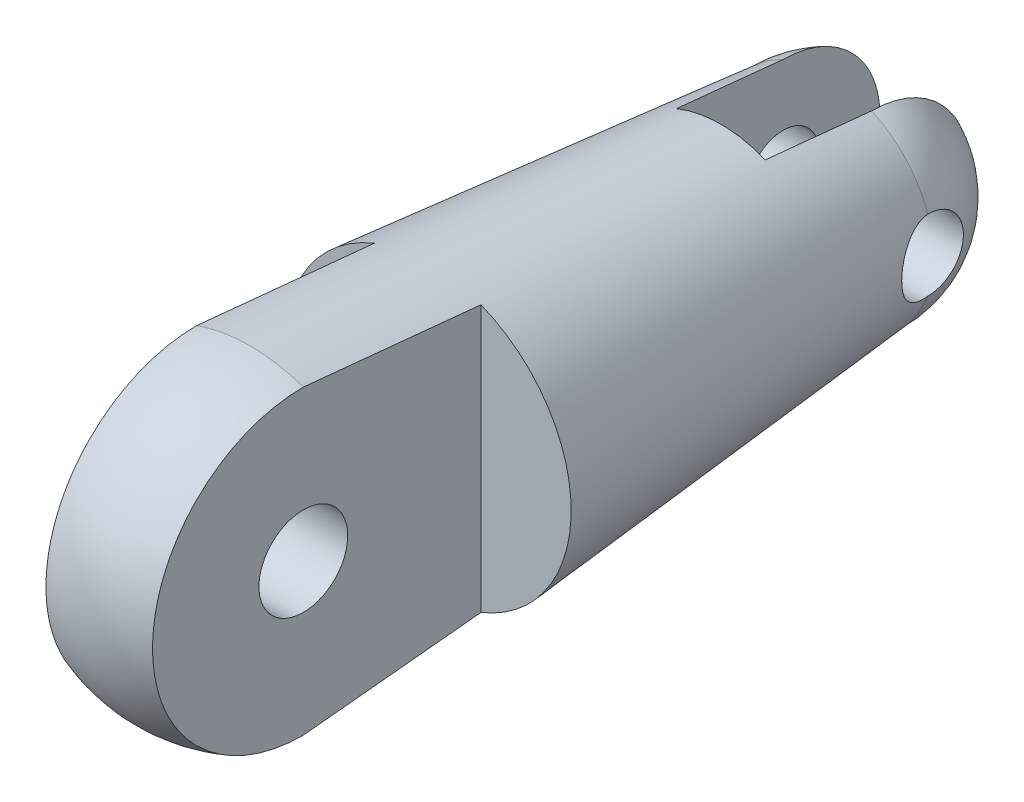
ISO-10303-21;
HEADER;
FILE_DESCRIPTION(('STEP AP214'),'2;1');
FILE_NAME('part.step','',(''),(''),'','','');
FILE_SCHEMA(('AUTOMOTIVE_DESIGN { 1 0 10303 214 1 1 1 1 }'));
ENDSEC;
DATA;
#1=APPLICATION_CONTEXT('core data for automotive mechanical design processes');
#2=APPLICATION_PROTOCOL_DEFINITION('international standard','automotive_design',2000,#1);
#3=PRODUCT_CONTEXT('',#1,'mechanical');
#4=PRODUCT('Part','Part','',(#3));
#5=PRODUCT_RELATED_PRODUCT_CATEGORY('part','',(#4));
#6=PRODUCT_DEFINITION_FORMATION('','',#4);
#7=PRODUCT_DEFINITION_CONTEXT('part definition',#1,'design');
#8=PRODUCT_DEFINITION('design','',#6,#7);
#9=PRODUCT_DEFINITION_SHAPE('','',#8);
#10=(LENGTH_UNIT() NAMED_UNIT(*) SI_UNIT(.MILLI.,.METRE.));
#11=(NAMED_UNIT(*) PLANE_ANGLE_UNIT() SI_UNIT($,.RADIAN.));
#12=(NAMED_UNIT(*) SI_UNIT($,.STERADIAN.) SOLID_ANGLE_UNIT());
#13=UNCERTAINTY_MEASURE_WITH_UNIT(LENGTH_MEASURE(1.E-05),#10,'distance_accuracy_value','');
#14=(GEOMETRIC_REPRESENTATION_CONTEXT(3) GLOBAL_UNCERTAINTY_ASSIGNED_CONTEXT((#13)) GLOBAL_UNIT_ASSIGNED_CONTEXT((#10,
#11,#12)) REPRESENTATION_CONTEXT('',''));
#15=CARTESIAN_POINT('',(0.,0.,0.));
#16=DIRECTION('',(0.,0.,1.));
#17=DIRECTION('',(1.,0.,0.));
#18=AXIS2_PLACEMENT_3D('',#15,#16,#17);
#19=CARTESIAN_POINT('',(0.,0.,-65.));
#20=DIRECTION('',(0.,0.,1.));
#21=DIRECTION('',(0.,1.,0.));
#22=AXIS2_PLACEMENT_3D('',#19,#20,#21);
#23=SPHERICAL_SURFACE('',#22,12.);
#24=CARTESIAN_POINT('',(0.,0.,-65.));
#25=DIRECTION('',(0.,0.,1.));
#26=DIRECTION('',(1.,0.,0.));
#27=AXIS2_PLACEMENT_3D('',#24,#25,#26);
#28=CIRCLE('',#27,12.);
#29=CARTESIAN_POINT('',(5.,-10.9087121146357,-65.));
#30=VERTEX_POINT('',#29);
#31=CARTESIAN_POINT('',(11.3137084989848,-4.00000000000001,-65.));
#32=VERTEX_POINT('',#31);
#33=EDGE_CURVE('E231',#30,#32,#28,.T.);
#34=ORIENTED_EDGE('',*,*,#33,.F.);
#35=CARTESIAN_POINT('',(5.,0.,-65.));
#36=DIRECTION('',(1.,0.,0.));
#37=DIRECTION('',(0.,0.,-1.));
#38=AXIS2_PLACEMENT_3D('',#35,#36,#37);
#39=CIRCLE('',#38,10.9087121146357);
#40=CARTESIAN_POINT('',(5.,10.9087121146357,-65.));
#41=VERTEX_POINT('',#40);
#42=EDGE_CURVE('E287',#30,#41,#39,.T.);
#43=ORIENTED_EDGE('',*,*,#42,.T.);
#44=CARTESIAN_POINT('',(11.3137084989848,4.00000000000001,-65.));
#45=VERTEX_POINT('',#44);
#46=EDGE_CURVE('E230',#45,#41,#28,.T.);
#47=ORIENTED_EDGE('',*,*,#46,.F.);
#48=CARTESIAN_POINT('',(11.3137084989847,0.,-65.));
#49=DIRECTION('',(-1.,0.,0.));
#50=DIRECTION('',(0.,0.,1.));
#51=AXIS2_PLACEMENT_3D('',#48,#49,#50);
#52=CIRCLE('',#51,4.00000000000001);
#53=EDGE_CURVE('E242',#45,#32,#52,.T.);
#54=ORIENTED_EDGE('',*,*,#53,.T.);
#55=EDGE_LOOP('',(#34,#43,#47,#54));
#56=FACE_BOUND('',#55,.T.);
#57=ADVANCED_FACE('F32',(#56),#23,.T.);
#58=CARTESIAN_POINT('',(-30.,0.,-65.));
#59=DIRECTION('',(1.,0.,0.));
#60=DIRECTION('',(0.,0.,-1.));
#61=AXIS2_PLACEMENT_3D('',#58,#59,#60);
#62=CYLINDRICAL_SURFACE('',#61,4.00000000000001);
#63=CARTESIAN_POINT('',(4.99999999999999,0.,-65.));
#64=DIRECTION('',(1.,0.,0.));
#65=DIRECTION('',(0.,0.,-1.));
#66=AXIS2_PLACEMENT_3D('',#63,#64,#65);
#67=CIRCLE('',#66,4.00000000000001);
#68=CARTESIAN_POINT('',(4.99999999999999,0.,-69.));
#69=VERTEX_POINT('',#68);
#70=EDGE_CURVE('E127',#69,#69,#67,.F.);
#71=ORIENTED_EDGE('',*,*,#70,.T.);
#72=EDGE_LOOP('',(#71));
#73=FACE_BOUND('',#72,.T.);
#74=CARTESIAN_POINT('',(11.3136889193321,-3.99999999500001,-65.0002));
#75=CARTESIAN_POINT('',(11.324630492324,-4.0000188985444,-64.888247238381));
#76=CARTESIAN_POINT('',(11.3372486413354,-3.99531162899844,-64.7764769898527));
#77=CARTESIAN_POINT('',(11.3655641849048,-3.97663549686389,-64.5541508803589));
#78=CARTESIAN_POINT('',(11.3812603159082,-3.96267042914925,-64.4435945406672));
#79=CARTESIAN_POINT('',(11.4154143093294,-3.9257265038677,-64.2247921820178));
#80=CARTESIAN_POINT('',(11.4338634610291,-3.90277571851407,-64.1165400643584));
#81=CARTESIAN_POINT('',(11.4731840801899,-3.84814246383926,-63.9027359940164));
#82=CARTESIAN_POINT('',(11.4940557452726,-3.81645928186475,-63.7971842624816));
#83=CARTESIAN_POINT('',(11.559638645672,-3.70883318762587,-63.4858524141516));
#84=CARTESIAN_POINT('',(11.6073928872525,-3.62023374742587,-63.284930133438));
#85=CARTESIAN_POINT('',(11.7072018660043,-3.41204049024545,-62.9010012743523));
#86=CARTESIAN_POINT('',(11.7592600905391,-3.29242136810618,-62.7180094919973));
#87=CARTESIAN_POINT('',(11.8660065035331,-3.01899452747802,-62.3660853926821));
#88=CARTESIAN_POINT('',(11.9207070077118,-2.86388360770343,-62.1981653894313));
#89=CARTESIAN_POINT('',(12.0257497683932,-2.52652920648225,-61.8905361327172));
#90=CARTESIAN_POINT('',(12.0760919238863,-2.34428509645979,-61.7508275329846));
#91=CARTESIAN_POINT('',(12.1681710436765,-1.95605825144464,-61.5032812826041));
#92=CARTESIAN_POINT('',(12.2098687593808,-1.74997358962555,-61.3955880727964));
#93=CARTESIAN_POINT('',(12.2803265364761,-1.32036795446154,-61.2170576727753));
#94=CARTESIAN_POINT('',(12.3090936181085,-1.09685651992023,-61.1462004804382));
#95=CARTESIAN_POINT('',(12.3493582530347,-0.654347967796119,-61.0478074394223));
#96=CARTESIAN_POINT('',(12.3618563838865,-0.436001028523253,-61.0177560856577));
#97=CARTESIAN_POINT('',(12.3717322504596,0.00297592825515853,-60.9939719305204));
#98=CARTESIAN_POINT('',(12.3691147767116,0.22360520030433,-61.0002276224977));
#99=CARTESIAN_POINT('',(12.3495504719681,0.648911475360917,-61.047487353356));
#100=CARTESIAN_POINT('',(12.3333447909486,0.853826583284769,-61.086694361935));
#101=CARTESIAN_POINT('',(12.2889802636455,1.2538754461441,-61.1959490856155));
#102=CARTESIAN_POINT('',(12.2608204334004,1.44900839441866,-61.2659993394821));
#103=CARTESIAN_POINT('',(12.1940933773547,1.82894584984347,-61.43639574557));
#104=CARTESIAN_POINT('',(12.155308845525,2.01342460556392,-61.5373803592151));
#105=CARTESIAN_POINT('',(12.0706713673664,2.36324052008424,-61.7659934453423));
#106=CARTESIAN_POINT('',(12.0248162909227,2.52857188405443,-61.8936299512518));
#107=CARTESIAN_POINT('',(11.9260954182738,2.84752303078532,-62.1820298449835));
#108=CARTESIAN_POINT('',(11.8729641362216,2.99954440517304,-62.344472731323));
#109=CARTESIAN_POINT('',(11.7667145237685,3.27472007230911,-62.6923019711751));
#110=CARTESIAN_POINT('',(11.7135962209198,3.39785674378613,-62.8777022251405));
#111=CARTESIAN_POINT('',(11.6095193682877,3.61659298206936,-63.2755367904688));
#112=CARTESIAN_POINT('',(11.5587413121279,3.71084124737574,-63.4887726094521));
#113=CARTESIAN_POINT('',(11.4895367142718,3.82357742171291,-63.8193851027782));
#114=CARTESIAN_POINT('',(11.4676342359538,3.85637811472637,-63.9313486010845));
#115=CARTESIAN_POINT('',(11.4265983754263,3.91215366490002,-64.1581765854436));
#116=CARTESIAN_POINT('',(11.4074636254566,3.93513338645341,-64.2730396054161));
#117=CARTESIAN_POINT('',(11.374666630502,3.96863060781973,-64.489726954363));
#118=CARTESIAN_POINT('',(11.3606163195393,3.98038006902405,-64.5913045317568));
#119=CARTESIAN_POINT('',(11.3351419759609,3.99606707357586,-64.7952698753495));
#120=CARTESIAN_POINT('',(11.3237150140991,4.00001336785234,-64.8976566045423));
#121=CARTESIAN_POINT('',(11.3136889193321,3.99999999500001,-65.0002));
#122=B_SPLINE_CURVE_WITH_KNOTS('',3,(#74,#75,#76,#77,#78,#79,#80,#81,#82,#83,#84,#85,#86,#87,
#88,#89,#90,#91,#92,#93,#94,#95,#96,#97,#98,#99,#100,#101,#102,#103,#104,#105,#106,#107,#108,
#109,#110,#111,#112,#113,#114,#115,#116,#117,#118,#119,#120,#121),.UNSPECIFIED.,.F.,.F.,(4,2,2,
2,2,2,2,2,2,2,2,2,2,2,2,2,2,2,2,2,2,2,2,4),(0.,0.337318177737528,0.674498170446622,
1.01063308078467,1.34679543131353,2.01770306442448,2.68915974013327,3.39103130635216,
4.09291913487536,4.79792715378902,5.50255194924793,6.16139700846207,6.82003327389311,
7.44491914756016,8.06985646637195,8.70867695803341,9.34769028197918,10.0308541061781,
10.7144336205814,11.4263172043703,11.7820541468133,12.137614685574,12.4469397547951,
12.7559177315556),.UNSPECIFIED.);
#123=EDGE_CURVE('E176',#32,#45,#122,.T.);
#124=ORIENTED_EDGE('',*,*,#123,.F.);
#125=ORIENTED_EDGE('',*,*,#53,.F.);
#126=EDGE_LOOP('',(#124,#125));
#127=FACE_BOUND('',#126,.T.);
#128=ADVANCED_FACE('F199',(#73,#127),#62,.F.);
#129=CARTESIAN_POINT('',(0.,0.,0.));
#130=DIRECTION('',(0.,0.,1.));
#131=DIRECTION('',(0.,1.,0.));
#132=AXIS2_PLACEMENT_3D('',#129,#130,#131);
#133=SPHERICAL_SURFACE('',#132,18.);
#134=CARTESIAN_POINT('',(0.,0.,0.));
#135=DIRECTION('',(0.,0.,1.));
#136=DIRECTION('',(1.,0.,0.));
#137=AXIS2_PLACEMENT_3D('',#134,#135,#136);
#138=CIRCLE('',#137,18.);
#139=CARTESIAN_POINT('',(-6.,-16.9705627484771,0.));
#140=VERTEX_POINT('',#139);
#141=CARTESIAN_POINT('',(6.,-16.9705627484771,0.));
#142=VERTEX_POINT('',#141);
#143=EDGE_CURVE('E236',#140,#142,#138,.T.);
#144=ORIENTED_EDGE('',*,*,#143,.T.);
#145=CARTESIAN_POINT('',(6.,0.,0.));
#146=DIRECTION('',(-1.,0.,0.));
#147=DIRECTION('',(0.,0.,1.));
#148=AXIS2_PLACEMENT_3D('',#145,#146,#147);
#149=CIRCLE('',#148,16.9705627484771);
#150=CARTESIAN_POINT('',(6.,16.9705627484771,0.));
#151=VERTEX_POINT('',#150);
#152=EDGE_CURVE('E268',#142,#151,#149,.T.);
#153=ORIENTED_EDGE('',*,*,#152,.T.);
#154=CARTESIAN_POINT('',(-6.,16.9705627484771,0.));
#155=VERTEX_POINT('',#154);
#156=EDGE_CURVE('E234',#151,#155,#138,.T.);
#157=ORIENTED_EDGE('',*,*,#156,.T.);
#158=CARTESIAN_POINT('',(-6.,0.,0.));
#159=DIRECTION('',(1.,0.,0.));
#160=DIRECTION('',(0.,0.,-1.));
#161=AXIS2_PLACEMENT_3D('',#158,#159,#160);
#162=CIRCLE('',#161,16.9705627484771);
#163=EDGE_CURVE('E253',#155,#140,#162,.T.);
#164=ORIENTED_EDGE('',*,*,#163,.T.);
#165=EDGE_LOOP('',(#144,#153,#157,#164));
#166=FACE_BOUND('',#165,.T.);
#167=ADVANCED_FACE('F34',(#166),#133,.T.);
#168=CARTESIAN_POINT('',(-5.,10.9087121146357,-65.));
#169=VERTEX_POINT('',#168);
#170=CARTESIAN_POINT('',(-11.3137084989848,4.00000000000001,-65.));
#171=VERTEX_POINT('',#170);
#172=EDGE_CURVE('E227',#169,#171,#28,.T.);
#173=ORIENTED_EDGE('',*,*,#172,.F.);
#174=CARTESIAN_POINT('',(-5.,0.,-65.));
#175=DIRECTION('',(-1.,0.,0.));
#176=DIRECTION('',(0.,0.,1.));
#177=AXIS2_PLACEMENT_3D('',#174,#175,#176);
#178=CIRCLE('',#177,10.9087121146357);
#179=CARTESIAN_POINT('',(-5.,-10.9087121146357,-65.));
#180=VERTEX_POINT('',#179);
#181=EDGE_CURVE('E47',#169,#180,#178,.T.);
#182=ORIENTED_EDGE('',*,*,#181,.T.);
#183=CARTESIAN_POINT('',(-11.3137084989848,-4.00000000000001,-65.));
#184=VERTEX_POINT('',#183);
#185=EDGE_CURVE('E126',#184,#180,#28,.T.);
#186=ORIENTED_EDGE('',*,*,#185,.F.);
#187=CARTESIAN_POINT('',(-11.3137084989848,0.,-65.));
#188=DIRECTION('',(1.,0.,0.));
#189=DIRECTION('',(0.,0.,-1.));
#190=AXIS2_PLACEMENT_3D('',#187,#188,#189);
#191=CIRCLE('',#190,4.00000000000001);
#192=EDGE_CURVE('E228',#184,#171,#191,.T.);
#193=ORIENTED_EDGE('',*,*,#192,.T.);
#194=EDGE_LOOP('',(#173,#182,#186,#193));
#195=FACE_BOUND('',#194,.T.);
#196=ADVANCED_FACE('F209',(#195),#23,.T.);
#197=CARTESIAN_POINT('',(0.,0.,-65.));
#198=DIRECTION('',(0.,0.,1.));
#199=DIRECTION('',(1.,0.,0.));
#200=AXIS2_PLACEMENT_3D('',#197,#198,#199);
#201=CONICAL_SURFACE('',#200,12.,0.0920468488634067);
#202=CARTESIAN_POINT('',(0.,0.,-20.));
#203=DIRECTION('',(0.,0.,-1.));
#204=DIRECTION('',(-1.,0.,0.));
#205=AXIS2_PLACEMENT_3D('',#202,#203,#204);
#206=CIRCLE('',#205,16.1538461538461);
#207=CARTESIAN_POINT('',(6.,14.9982247470202,-20.));
#208=VERTEX_POINT('',#207);
#209=CARTESIAN_POINT('',(6.,-14.9982247470202,-20.));
#210=VERTEX_POINT('',#209);
#211=EDGE_CURVE('E166',#208,#210,#206,.T.);
#212=ORIENTED_EDGE('',*,*,#211,.T.);
#213=CARTESIAN_POINT('',(6.,-12.4328661753176,-45.4465645818424));
#214=CARTESIAN_POINT('',(6.,-12.6477037814034,-43.3504001328621));
#215=CARTESIAN_POINT('',(6.,-12.8615170062301,-41.2541310091683));
#216=CARTESIAN_POINT('',(6.,-13.287347927037,-37.0614107162263));
#217=CARTESIAN_POINT('',(6.,-13.4993656233162,-34.9649595470085));
#218=CARTESIAN_POINT('',(6.,-14.1331050409651,-28.6753762093162));
#219=CARTESIAN_POINT('',(6.,-14.5525134315511,-24.4820108815449));
#220=CARTESIAN_POINT('',(6.,-15.1382375429859,-18.5920969027039));
#221=CARTESIAN_POINT('',(6.,-15.3065393320408,-16.8957452521665));
#222=CARTESIAN_POINT('',(6.,-15.9736676961094,-10.1573857753291));
#223=CARTESIAN_POINT('',(6.,-16.4697384962365,-5.11510485333078));
#224=CARTESIAN_POINT('',(6.,-17.2103134061365,2.44866122563647));
#225=CARTESIAN_POINT('',(6.,-17.4565831483887,4.96997390399984));
#226=CARTESIAN_POINT('',(6.,-17.9480760871612,10.0127009259002));
#227=CARTESIAN_POINT('',(6.,-18.193299283824,12.5341152694233));
#228=CARTESIAN_POINT('',(6.,-18.4380645122989,15.0555741282608));
#229=B_SPLINE_CURVE_WITH_KNOTS('',3,(#213,#214,#215,#216,#217,#218,#219,#220,#221,#222,#223,
#224,#225,#226,#227,#228),.UNSPECIFIED.,.F.,.F.,(4,2,2,2,2,2,2,4),(0.,6.32143464463242,
12.6428682365382,25.2857253805145,30.3997657999397,45.5996352670396,53.1995692131898,
60.7995021254498),.UNSPECIFIED.);
#230=EDGE_CURVE('E262',#210,#142,#229,.T.);
#231=ORIENTED_EDGE('',*,*,#230,.T.);
#232=ORIENTED_EDGE('',*,*,#143,.F.);
#233=CARTESIAN_POINT('',(-6.,-18.4380645122989,15.0555741282608));
#234=CARTESIAN_POINT('',(-6.,-18.193298878624,12.5341128266805));
#235=CARTESIAN_POINT('',(-6.,-17.9480755238892,10.0126959980363));
#236=CARTESIAN_POINT('',(-6.,-17.4565822883183,4.96996422839427));
#237=CARTESIAN_POINT('',(-6.,-17.2103124074322,2.4486492874013));
#238=CARTESIAN_POINT('',(-6.,-16.4697372360267,-5.11511423506275));
#239=CARTESIAN_POINT('',(-6.,-15.9736655736271,-10.1573902109873));
#240=CARTESIAN_POINT('',(-6.,-15.2249009825744,-17.7203455043561));
#241=CARTESIAN_POINT('',(-6.,-14.974536477419,-20.2412554062521));
#242=CARTESIAN_POINT('',(-6.,-14.4719951832759,-25.2828944317209));
#243=CARTESIAN_POINT('',(-6.,-14.2198183944362,-27.8036235553086));
#244=CARTESIAN_POINT('',(-6.,-13.7133513919805,-32.8448738467034));
#245=CARTESIAN_POINT('',(-6.,-13.4590611748652,-35.3653950141594));
#246=CARTESIAN_POINT('',(-6.,-12.9479580632252,-40.4061822415341));
#247=CARTESIAN_POINT('',(-6.,-12.6911451679628,-42.9264483013781));
#248=CARTESIAN_POINT('',(-6.,-12.4328661753176,-45.4465645818424));
#249=B_SPLINE_CURVE_WITH_KNOTS('',3,(#233,#234,#235,#236,#237,#238,#239,#240,#241,#242,#243,
#244,#245,#246,#247,#248),.UNSPECIFIED.,.F.,.F.,(4,2,2,2,2,2,2,4),(0.,7.59994036025819,
15.1998810844246,30.3997363255114,37.9996714787732,45.599606010975,53.1995531286789,
60.799502468923),.UNSPECIFIED.);
#250=CARTESIAN_POINT('',(-6.,-14.9982247470202,-20.));
#251=VERTEX_POINT('',#250);
#252=EDGE_CURVE('E247',#140,#251,#249,.T.);
#253=ORIENTED_EDGE('',*,*,#252,.T.);
#254=CARTESIAN_POINT('',(0.,0.,-20.));
#255=DIRECTION('',(0.,0.,-1.));
#256=DIRECTION('',(-1.,0.,0.));
#257=AXIS2_PLACEMENT_3D('',#254,#255,#256);
#258=CIRCLE('',#257,16.1538461538461);
#259=CARTESIAN_POINT('',(-6.,14.9982247470202,-20.));
#260=VERTEX_POINT('',#259);
#261=EDGE_CURVE('E169',#251,#260,#258,.T.);
#262=ORIENTED_EDGE('',*,*,#261,.T.);
#263=CARTESIAN_POINT('',(-6.,12.4328661753176,-45.4465645818424));
#264=CARTESIAN_POINT('',(-6.,12.6477037814034,-43.3504001328621));
#265=CARTESIAN_POINT('',(-6.,12.8615170062301,-41.2541310091683));
#266=CARTESIAN_POINT('',(-6.,13.287347927037,-37.0614107162263));
#267=CARTESIAN_POINT('',(-6.,13.4993656233162,-34.9649595470085));
#268=CARTESIAN_POINT('',(-6.,14.1331050409651,-28.6753762093162));
#269=CARTESIAN_POINT('',(-6.,14.5525134315511,-24.4820108815449));
#270=CARTESIAN_POINT('',(-6.,15.1382375429859,-18.5920969027039));
#271=CARTESIAN_POINT('',(-6.,15.3065393320408,-16.8957452521665));
#272=CARTESIAN_POINT('',(-6.,15.9736676961094,-10.1573857753291));
#273=CARTESIAN_POINT('',(-6.,16.4697384962365,-5.1151048533308));
#274=CARTESIAN_POINT('',(-6.,17.2103134061365,2.44866122563643));
#275=CARTESIAN_POINT('',(-6.,17.4565831483887,4.96997390399981));
#276=CARTESIAN_POINT('',(-6.,17.9480760871613,10.0127009259002));
#277=CARTESIAN_POINT('',(-6.,18.193299283824,12.5341152694233));
#278=CARTESIAN_POINT('',(-6.,18.4380645122989,15.0555741282608));
#279=B_SPLINE_CURVE_WITH_KNOTS('',3,(#263,#264,#265,#266,#267,#268,#269,#270,#271,#272,#273,
#274,#275,#276,#277,#278),.UNSPECIFIED.,.F.,.F.,(4,2,2,2,2,2,2,4),(0.,6.32143464463241,
12.6428682365382,25.2857253805145,30.3997657999397,45.5996352670396,53.1995692131897,
60.7995021254498),.UNSPECIFIED.);
#280=EDGE_CURVE('E180',#260,#155,#279,.T.);
#281=ORIENTED_EDGE('',*,*,#280,.T.);
#282=ORIENTED_EDGE('',*,*,#156,.F.);
#283=CARTESIAN_POINT('',(6.,18.4380645122989,15.0555741282608));
#284=CARTESIAN_POINT('',(6.,18.193298878624,12.5341128266805));
#285=CARTESIAN_POINT('',(6.,17.9480755238892,10.0126959980363));
#286=CARTESIAN_POINT('',(6.,17.4565822883183,4.96996422839427));
#287=CARTESIAN_POINT('',(6.,17.2103124074322,2.4486492874013));
#288=CARTESIAN_POINT('',(6.,16.4697372360267,-5.11511423506274));
#289=CARTESIAN_POINT('',(6.,15.9736655736271,-10.1573902109873));
#290=CARTESIAN_POINT('',(6.,15.2249009825744,-17.7203455043561));
#291=CARTESIAN_POINT('',(6.,14.974536477419,-20.2412554062521));
#292=CARTESIAN_POINT('',(6.,14.4719951832759,-25.2828944317209));
#293=CARTESIAN_POINT('',(6.,14.2198183944363,-27.8036235553086));
#294=CARTESIAN_POINT('',(6.,13.7133513919805,-32.8448738467035));
#295=CARTESIAN_POINT('',(6.,13.4590611748652,-35.3653950141594));
#296=CARTESIAN_POINT('',(6.,12.9479580632252,-40.4061822415341));
#297=CARTESIAN_POINT('',(6.,12.6911451679628,-42.9264483013781));
#298=CARTESIAN_POINT('',(6.,12.4328661753176,-45.4465645818424));
#299=B_SPLINE_CURVE_WITH_KNOTS('',3,(#283,#284,#285,#286,#287,#288,#289,#290,#291,#292,#293,
#294,#295,#296,#297,#298),.UNSPECIFIED.,.F.,.F.,(4,2,2,2,2,2,2,4),(0.,7.59994036025819,
15.1998810844246,30.3997363255114,37.9996714787732,45.599606010975,53.1995531286789,
60.799502468923),.UNSPECIFIED.);
#300=EDGE_CURVE('E173',#151,#208,#299,.T.);
#301=ORIENTED_EDGE('',*,*,#300,.T.);
#302=EDGE_LOOP('',(#212,#231,#232,#253,#262,#281,#282,#301));
#303=FACE_BOUND('',#302,.T.);
#304=CARTESIAN_POINT('',(0.,0.,-53.));
#305=DIRECTION('',(0.,0.,1.));
#306=DIRECTION('',(1.,0.,0.));
#307=AXIS2_PLACEMENT_3D('',#304,#305,#306);
#308=CIRCLE('',#307,13.1076923076923);
#309=CARTESIAN_POINT('',(-5.,-12.1165835792576,-53.));
#310=VERTEX_POINT('',#309);
#311=CARTESIAN_POINT('',(5.,-12.1165835792576,-53.));
#312=VERTEX_POINT('',#311);
#313=EDGE_CURVE('E11',#310,#312,#308,.T.);
#314=ORIENTED_EDGE('',*,*,#313,.T.);
#315=CARTESIAN_POINT('',(5.,-13.4682780079718,-39.3635990064088));
#316=CARTESIAN_POINT('',(5.,-13.2843443732745,-41.2316190440163));
#317=CARTESIAN_POINT('',(5.,-13.0999634976774,-43.0995949898944));
#318=CARTESIAN_POINT('',(5.,-12.7301747642655,-46.8354453710516));
#319=CARTESIAN_POINT('',(5.,-12.5447669063656,-48.7033198063223));
#320=CARTESIAN_POINT('',(5.,-11.9868053204571,-54.3067586804967));
#321=CARTESIAN_POINT('',(5.,-11.6125124286873,-58.0421503999031));
#322=CARTESIAN_POINT('',(5.,-11.0464402458012,-63.6447732895896));
#323=CARTESIAN_POINT('',(5.,-10.856977197319,-65.5122385569459));
#324=CARTESIAN_POINT('',(5.,-10.4762358665056,-69.2469838363415));
#325=CARTESIAN_POINT('',(4.99999999999999,-10.2849575844646,-71.1142638484103));
#326=CARTESIAN_POINT('',(4.99999999999999,-9.90026918136819,-74.8486101760253));
#327=CARTESIAN_POINT('',(4.99999999999999,-9.70685905388759,-76.7156764909101));
#328=CARTESIAN_POINT('',(4.99999999999999,-9.31746842182258,-80.4495420383162));
#329=CARTESIAN_POINT('',(4.99999999999999,-9.12148791577496,-82.3163412706847));
#330=CARTESIAN_POINT('',(4.99999999999999,-8.92400277762602,-84.1829820210738));
#331=B_SPLINE_CURVE_WITH_KNOTS('',3,(#315,#316,#317,#318,#319,#320,#321,#322,#323,#324,#325,
#326,#327,#328,#329,#330),.UNSPECIFIED.,.F.,.F.,(4,2,2,2,2,2,2,4),(0.,5.63116077828876,
11.2623220231491,22.5246092070418,28.1557633684728,33.7869166293464,39.418086866466,
45.0492603093506),.UNSPECIFIED.);
#332=EDGE_CURVE('E283',#312,#30,#331,.T.);
#333=ORIENTED_EDGE('',*,*,#332,.T.);
#334=ORIENTED_EDGE('',*,*,#33,.T.);
#335=ORIENTED_EDGE('',*,*,#123,.T.);
#336=ORIENTED_EDGE('',*,*,#46,.T.);
#337=CARTESIAN_POINT('',(4.99999999999999,8.92400277762602,-84.1829820210738));
#338=CARTESIAN_POINT('',(4.99999999999999,9.08828337005977,-82.6302800197055));
#339=CARTESIAN_POINT('',(4.99999999999999,9.25151145856417,-81.0774671191789));
#340=CARTESIAN_POINT('',(4.99999999999999,9.57613513301257,-77.9716502457469));
#341=CARTESIAN_POINT('',(4.99999999999999,9.73753071956027,-76.4186462729045));
#342=CARTESIAN_POINT('',(4.99999999999999,10.2193771676262,-71.7593969173783));
#343=CARTESIAN_POINT('',(4.99999999999999,10.5374882043539,-68.6529094813226));
#344=CARTESIAN_POINT('',(5.,10.9809036773954,-64.2899025136758));
#345=CARTESIAN_POINT('',(5.,11.1081923428816,-63.0335839448593));
#346=CARTESIAN_POINT('',(5.,11.6125149402687,-58.0421443118428));
#347=CARTESIAN_POINT('',(5.,11.9868069844015,-54.3067458711469));
#348=CARTESIAN_POINT('',(5.,12.5447683357551,-48.7033035140348));
#349=CARTESIAN_POINT('',(5.,12.7301759793199,-46.835432160038));
#350=CARTESIAN_POINT('',(5.,13.0999642570337,-43.0995882542151));
#351=CARTESIAN_POINT('',(5.,13.2843448914394,-41.2316157024144));
#352=CARTESIAN_POINT('',(5.,13.4682780079718,-39.3635990064088));
#353=B_SPLINE_CURVE_WITH_KNOTS('',3,(#337,#338,#339,#340,#341,#342,#343,#344,#345,#346,#347,
#348,#349,#350,#351,#352),.UNSPECIFIED.,.F.,.F.,(4,2,2,2,2,2,2,4),(0.,4.68410445562328,
9.3682073680723,18.7363992670968,22.524650639354,33.7869572395627,39.4181092471533,
45.0492598463929),.UNSPECIFIED.);
#354=CARTESIAN_POINT('',(5.,12.1165835792576,-53.));
#355=VERTEX_POINT('',#354);
#356=EDGE_CURVE('E130',#41,#355,#353,.T.);
#357=ORIENTED_EDGE('',*,*,#356,.T.);
#358=CARTESIAN_POINT('',(-5.,12.1165835792576,-53.));
#359=VERTEX_POINT('',#358);
#360=EDGE_CURVE('E36',#355,#359,#308,.T.);
#361=ORIENTED_EDGE('',*,*,#360,.T.);
#362=CARTESIAN_POINT('',(-5.,13.4682780079718,-39.3635990064088));
#363=CARTESIAN_POINT('',(-5.,13.2843443732745,-41.2316190440163));
#364=CARTESIAN_POINT('',(-5.,13.0999634976773,-43.0995949898944));
#365=CARTESIAN_POINT('',(-5.,12.7301747642655,-46.8354453710516));
#366=CARTESIAN_POINT('',(-5.,12.5447669063656,-48.7033198063223));
#367=CARTESIAN_POINT('',(-5.,11.9868053204571,-54.3067586804967));
#368=CARTESIAN_POINT('',(-5.,11.6125124286873,-58.0421503999031));
#369=CARTESIAN_POINT('',(-5.,11.0464402458012,-63.6447732895896));
#370=CARTESIAN_POINT('',(-5.,10.856977197319,-65.5122385569459));
#371=CARTESIAN_POINT('',(-5.,10.4762358665056,-69.2469838363415));
#372=CARTESIAN_POINT('',(-5.00000000000001,10.2849575844646,-71.1142638484103));
#373=CARTESIAN_POINT('',(-5.00000000000001,9.90026918136818,-74.8486101760253));
#374=CARTESIAN_POINT('',(-5.00000000000001,9.70685905388758,-76.7156764909101));
#375=CARTESIAN_POINT('',(-5.00000000000001,9.31746842182258,-80.4495420383162));
#376=CARTESIAN_POINT('',(-5.00000000000001,9.12148791577496,-82.3163412706847));
#377=CARTESIAN_POINT('',(-5.00000000000001,8.92400277762601,-84.1829820210738));
#378=B_SPLINE_CURVE_WITH_KNOTS('',3,(#362,#363,#364,#365,#366,#367,#368,#369,#370,#371,#372,
#373,#374,#375,#376,#377),.UNSPECIFIED.,.F.,.F.,(4,2,2,2,2,2,2,4),(0.,5.63116077828876,
11.2623220231491,22.5246092070418,28.1557633684728,33.7869166293464,39.418086866466,
45.0492603093506),.UNSPECIFIED.);
#379=EDGE_CURVE('E120',#359,#169,#378,.T.);
#380=ORIENTED_EDGE('',*,*,#379,.T.);
#381=ORIENTED_EDGE('',*,*,#172,.T.);
#382=CARTESIAN_POINT('',(-11.3136889193321,3.99999999500001,-65.0002));
#383=CARTESIAN_POINT('',(-11.324630492324,4.0000188985444,-64.888247238381));
#384=CARTESIAN_POINT('',(-11.3372486413354,3.99531162899844,-64.7764769898527));
#385=CARTESIAN_POINT('',(-11.3655641849048,3.97663549686389,-64.5541508803589));
#386=CARTESIAN_POINT('',(-11.3812603159082,3.96267042914925,-64.4435945406672));
#387=CARTESIAN_POINT('',(-11.4154143093294,3.9257265038677,-64.2247921820178));
#388=CARTESIAN_POINT('',(-11.4338634610291,3.90277571851407,-64.1165400643584));
#389=CARTESIAN_POINT('',(-11.4731840801899,3.84814246383926,-63.9027359940164));
#390=CARTESIAN_POINT('',(-11.4940557452726,3.81645928186474,-63.7971842624816));
#391=CARTESIAN_POINT('',(-11.559638645672,3.70883318762587,-63.4858524141516));
#392=CARTESIAN_POINT('',(-11.6073928872525,3.62023374742587,-63.284930133438));
#393=CARTESIAN_POINT('',(-11.7072018660043,3.41204049024545,-62.9010012743523));
#394=CARTESIAN_POINT('',(-11.7592600905391,3.29242136810617,-62.7180094919973));
#395=CARTESIAN_POINT('',(-11.8660065035331,3.018994527478,-62.3660853926821));
#396=CARTESIAN_POINT('',(-11.9207070077118,2.86388360770341,-62.1981653894313));
#397=CARTESIAN_POINT('',(-12.0257497683932,2.52652920648223,-61.8905361327172));
#398=CARTESIAN_POINT('',(-12.0760919238863,2.34428509645978,-61.7508275329846));
#399=CARTESIAN_POINT('',(-12.1681710436765,1.95605825144462,-61.5032812826041));
#400=CARTESIAN_POINT('',(-12.2098687593808,1.74997358962554,-61.3955880727964));
#401=CARTESIAN_POINT('',(-12.2803265364761,1.32036795446153,-61.2170576727753));
#402=CARTESIAN_POINT('',(-12.3090936181085,1.09685651992022,-61.1462004804382));
#403=CARTESIAN_POINT('',(-12.3493582530347,0.654347967796108,-61.0478074394223));
#404=CARTESIAN_POINT('',(-12.3618563838865,0.436001028523242,-61.0177560856577));
#405=CARTESIAN_POINT('',(-12.3717322504596,-0.00297592825517016,-60.9939719305204));
#406=CARTESIAN_POINT('',(-12.3691147767116,-0.223605200304341,-61.0002276224977));
#407=CARTESIAN_POINT('',(-12.3495504719681,-0.648911475360929,-61.047487353356));
#408=CARTESIAN_POINT('',(-12.3333447909486,-0.853826583284782,-61.086694361935));
#409=CARTESIAN_POINT('',(-12.2889802636455,-1.25387544614411,-61.1959490856155));
#410=CARTESIAN_POINT('',(-12.2608204334004,-1.44900839441867,-61.2659993394821));
#411=CARTESIAN_POINT('',(-12.1940933773547,-1.82894584984348,-61.4363957455701));
#412=CARTESIAN_POINT('',(-12.155308845525,-2.01342460556393,-61.5373803592151));
#413=CARTESIAN_POINT('',(-12.0706713673664,-2.36324052008425,-61.7659934453423));
#414=CARTESIAN_POINT('',(-12.0248162909227,-2.52857188405444,-61.8936299512518));
#415=CARTESIAN_POINT('',(-11.9260954182738,-2.84752303078532,-62.1820298449835));
#416=CARTESIAN_POINT('',(-11.8729641362216,-2.99954440517304,-62.344472731323));
#417=CARTESIAN_POINT('',(-11.7667145237685,-3.2747200723091,-62.692301971175));
#418=CARTESIAN_POINT('',(-11.7135962209198,-3.39785674378613,-62.8777022251405));
#419=CARTESIAN_POINT('',(-11.6095193682877,-3.61659298206936,-63.2755367904688));
#420=CARTESIAN_POINT('',(-11.5587413121279,-3.71084124737574,-63.4887726094521));
#421=CARTESIAN_POINT('',(-11.4895367142718,-3.82357742171291,-63.8193851027782));
#422=CARTESIAN_POINT('',(-11.4676342359538,-3.85637811472637,-63.9313486010845));
#423=CARTESIAN_POINT('',(-11.4265983754263,-3.91215366490002,-64.1581765854437));
#424=CARTESIAN_POINT('',(-11.4074636254566,-3.93513338645341,-64.2730396054161));
#425=CARTESIAN_POINT('',(-11.374666630502,-3.96863060781973,-64.489726954363));
#426=CARTESIAN_POINT('',(-11.3606163195393,-3.98038006902405,-64.5913045317568));
#427=CARTESIAN_POINT('',(-11.3351419759609,-3.99606707357586,-64.7952698753495));
#428=CARTESIAN_POINT('',(-11.3237150140991,-4.00001336785234,-64.8976566045423));
#429=CARTESIAN_POINT('',(-11.3136889193321,-3.99999999500001,-65.0002));
#430=B_SPLINE_CURVE_WITH_KNOTS('',3,(#382,#383,#384,#385,#386,#387,#388,#389,#390,#391,#392,
#393,#394,#395,#396,#397,#398,#399,#400,#401,#402,#403,#404,#405,#406,#407,#408,#409,#410,#411,
#412,#413,#414,#415,#416,#417,#418,#419,#420,#421,#422,#423,#424,#425,#426,#427,#428,#429),
.UNSPECIFIED.,.F.,.F.,(4,2,2,2,2,2,2,2,2,2,2,2,2,2,2,2,2,2,2,2,2,2,2,4),(0.,0.337318177737542,
0.674498170446636,1.01063308078466,1.34679543131355,2.01770306442449,2.68915974013329,
3.39103130635219,4.09291913487538,4.79792715378904,5.50255194924794,6.16139700846208,
6.82003327389312,7.44491914756018,8.06985646637196,8.70867695803341,9.3476902819792,
10.0308541061781,10.7144336205814,11.4263172043703,11.7820541468133,12.137614685574,
12.4469397547951,12.7559177315556),.UNSPECIFIED.);
#431=EDGE_CURVE('E188',#171,#184,#430,.T.);
#432=ORIENTED_EDGE('',*,*,#431,.T.);
#433=ORIENTED_EDGE('',*,*,#185,.T.);
#434=CARTESIAN_POINT('',(-5.00000000000001,-8.92400277762601,-84.1829820210738));
#435=CARTESIAN_POINT('',(-5.00000000000001,-9.08828337005976,-82.6302800197055));
#436=CARTESIAN_POINT('',(-5.00000000000001,-9.25151145856417,-81.0774671191789));
#437=CARTESIAN_POINT('',(-5.00000000000001,-9.57613513301256,-77.9716502457469));
#438=CARTESIAN_POINT('',(-5.00000000000001,-9.73753071956026,-76.4186462729045));
#439=CARTESIAN_POINT('',(-5.00000000000001,-10.2193771676262,-71.7593969173783));
#440=CARTESIAN_POINT('',(-5.00000000000001,-10.5374882043539,-68.6529094813226));
#441=CARTESIAN_POINT('',(-5.,-10.9809036773954,-64.2899025136758));
#442=CARTESIAN_POINT('',(-5.,-11.1081923428816,-63.0335839448593));
#443=CARTESIAN_POINT('',(-5.,-11.6125149402687,-58.0421443118428));
#444=CARTESIAN_POINT('',(-5.,-11.9868069844015,-54.3067458711469));
#445=CARTESIAN_POINT('',(-5.,-12.5447683357551,-48.7033035140348));
#446=CARTESIAN_POINT('',(-5.,-12.7301759793199,-46.835432160038));
#447=CARTESIAN_POINT('',(-5.,-13.0999642570337,-43.0995882542151));
#448=CARTESIAN_POINT('',(-5.,-13.2843448914394,-41.2316157024144));
#449=CARTESIAN_POINT('',(-5.,-13.4682780079718,-39.3635990064088));
#450=B_SPLINE_CURVE_WITH_KNOTS('',3,(#434,#435,#436,#437,#438,#439,#440,#441,#442,#443,#444,
#445,#446,#447,#448,#449),.UNSPECIFIED.,.F.,.F.,(4,2,2,2,2,2,2,4),(0.,4.68410445562328,
9.3682073680723,18.7363992670968,22.524650639354,33.7869572395627,39.4181092471533,
45.0492598463929),.UNSPECIFIED.);
#451=EDGE_CURVE('E119',#180,#310,#450,.T.);
#452=ORIENTED_EDGE('',*,*,#451,.T.);
#453=EDGE_LOOP('',(#314,#333,#334,#335,#336,#357,#361,#380,#381,#432,#433,#452));
#454=FACE_BOUND('',#453,.T.);
#455=ADVANCED_FACE('F123',(#303,#454),#201,.T.);
#456=CARTESIAN_POINT('',(-30.,0.,0.));
#457=DIRECTION('',(1.,0.,0.));
#458=DIRECTION('',(0.,0.,-1.));
#459=AXIS2_PLACEMENT_3D('',#456,#457,#458);
#460=CYLINDRICAL_SURFACE('',#459,5.);
#461=CARTESIAN_POINT('',(6.,0.,0.));
#462=DIRECTION('',(-1.,0.,0.));
#463=DIRECTION('',(0.,0.,1.));
#464=AXIS2_PLACEMENT_3D('',#461,#462,#463);
#465=CIRCLE('',#464,5.);
#466=CARTESIAN_POINT('',(5.99999999999999,0.,-5.));
#467=VERTEX_POINT('',#466);
#468=EDGE_CURVE('E170',#467,#467,#465,.F.);
#469=CARTESIAN_POINT('',(-6.,0.,0.));
#470=DIRECTION('',(1.,0.,0.));
#471=DIRECTION('',(0.,0.,-1.));
#472=AXIS2_PLACEMENT_3D('',#469,#470,#471);
#473=CIRCLE('',#472,5.);
#474=CARTESIAN_POINT('',(-6.00000000000001,0.,-5.));
#475=VERTEX_POINT('',#474);
#476=EDGE_CURVE('E177',#475,#475,#473,.F.);
#477=CARTESIAN_POINT('',(5.99999999999999,0.,-5.));
#478=CARTESIAN_POINT('',(5.87499999999999,0.,-5.));
#479=CARTESIAN_POINT('',(5.74999999999999,0.,-5.));
#480=CARTESIAN_POINT('',(5.49999999999999,0.,-5.));
#481=CARTESIAN_POINT('',(5.37499999999999,0.,-5.));
#482=CARTESIAN_POINT('',(5.12499999999999,0.,-5.));
#483=CARTESIAN_POINT('',(4.99999999999999,0.,-5.));
#484=CARTESIAN_POINT('',(4.74999999999999,0.,-5.));
#485=CARTESIAN_POINT('',(4.62499999999999,0.,-5.));
#486=CARTESIAN_POINT('',(4.37499999999999,0.,-5.));
#487=CARTESIAN_POINT('',(4.24999999999999,0.,-5.));
#488=CARTESIAN_POINT('',(3.99999999999999,0.,-5.));
#489=CARTESIAN_POINT('',(3.87499999999999,0.,-5.));
#490=CARTESIAN_POINT('',(3.62499999999999,0.,-5.));
#491=CARTESIAN_POINT('',(3.49999999999999,0.,-5.));
#492=CARTESIAN_POINT('',(3.24999999999999,0.,-5.));
#493=CARTESIAN_POINT('',(3.12499999999999,0.,-5.));
#494=CARTESIAN_POINT('',(2.87499999999999,0.,-5.));
#495=CARTESIAN_POINT('',(2.74999999999999,0.,-5.));
#496=CARTESIAN_POINT('',(2.49999999999999,0.,-5.));
#497=CARTESIAN_POINT('',(2.37499999999999,0.,-5.));
#498=CARTESIAN_POINT('',(2.12499999999999,0.,-5.));
#499=CARTESIAN_POINT('',(1.99999999999999,0.,-5.));
#500=CARTESIAN_POINT('',(1.74999999999999,0.,-5.));
#501=CARTESIAN_POINT('',(1.62499999999999,0.,-5.));
#502=CARTESIAN_POINT('',(1.37499999999999,0.,-5.));
#503=CARTESIAN_POINT('',(1.25,0.,-5.));
#504=CARTESIAN_POINT('',(0.999999999999997,0.,-5.));
#505=CARTESIAN_POINT('',(0.874999999999997,0.,-5.));
#506=CARTESIAN_POINT('',(0.624999999999997,0.,-5.));
#507=CARTESIAN_POINT('',(0.499999999999997,0.,-5.));
#508=CARTESIAN_POINT('',(0.249999999999997,0.,-5.));
#509=CARTESIAN_POINT('',(0.124999999999997,0.,-5.));
#510=CARTESIAN_POINT('',(-0.125000000000004,0.,-5.));
#511=CARTESIAN_POINT('',(-0.250000000000004,0.,-5.));
#512=CARTESIAN_POINT('',(-0.500000000000004,0.,-5.));
#513=CARTESIAN_POINT('',(-0.625000000000004,0.,-5.));
#514=CARTESIAN_POINT('',(-0.875000000000004,0.,-5.));
#515=CARTESIAN_POINT('',(-1.,0.,-5.));
#516=CARTESIAN_POINT('',(-1.25,0.,-5.));
#517=CARTESIAN_POINT('',(-1.375,0.,-5.));
#518=CARTESIAN_POINT('',(-1.625,0.,-5.));
#519=CARTESIAN_POINT('',(-1.75,0.,-5.));
#520=CARTESIAN_POINT('',(-2.,0.,-5.));
#521=CARTESIAN_POINT('',(-2.125,0.,-5.));
#522=CARTESIAN_POINT('',(-2.375,0.,-5.));
#523=CARTESIAN_POINT('',(-2.5,0.,-5.));
#524=CARTESIAN_POINT('',(-2.75,0.,-5.));
#525=CARTESIAN_POINT('',(-2.875,0.,-5.));
#526=CARTESIAN_POINT('',(-3.125,0.,-5.));
#527=CARTESIAN_POINT('',(-3.25,0.,-5.));
#528=CARTESIAN_POINT('',(-3.5,0.,-5.));
#529=CARTESIAN_POINT('',(-3.625,0.,-5.));
#530=CARTESIAN_POINT('',(-3.875,0.,-5.));
#531=CARTESIAN_POINT('',(-4.,0.,-5.));
#532=CARTESIAN_POINT('',(-4.25,0.,-5.));
#533=CARTESIAN_POINT('',(-4.375,0.,-5.));
#534=CARTESIAN_POINT('',(-4.625,0.,-5.));
#535=CARTESIAN_POINT('',(-4.75,0.,-5.));
#536=CARTESIAN_POINT('',(-5.,0.,-5.));
#537=CARTESIAN_POINT('',(-5.125,0.,-5.));
#538=CARTESIAN_POINT('',(-5.375,0.,-5.));
#539=CARTESIAN_POINT('',(-5.50000000000001,0.,-5.));
#540=CARTESIAN_POINT('',(-5.75000000000001,0.,-5.));
#541=CARTESIAN_POINT('',(-5.87500000000001,0.,-5.));
#542=CARTESIAN_POINT('',(-6.00000000000001,0.,-5.));
#543=B_SPLINE_CURVE_WITH_KNOTS('',3,(#477,#478,#479,#480,#481,#482,#483,#484,#485,#486,#487,
#488,#489,#490,#491,#492,#493,#494,#495,#496,#497,#498,#499,#500,#501,#502,#503,#504,#505,#506,
#507,#508,#509,#510,#511,#512,#513,#514,#515,#516,#517,#518,#519,#520,#521,#522,#523,#524,#525,
#526,#527,#528,#529,#530,#531,#532,#533,#534,#535,#536,#537,#538,#539,#540,#541,#542),
.UNSPECIFIED.,.F.,.F.,(4,2,2,2,2,2,2,2,2,2,2,2,2,2,2,2,2,2,2,2,2,2,2,2,2,2,2,2,2,2,2,2,4),(0.,
0.375,0.750000000000001,1.125,1.5,1.875,2.25,2.625,3.,3.375,3.75,4.125,4.5,4.875,5.25,5.625,6.,
6.375,6.75,7.125,7.5,7.875,8.25,8.625,9.,9.375,9.75,10.125,10.5,10.875,11.25,11.625,12.),.UNSPECIFIED.);
#544=EDGE_CURVE('BSEAM198',#467,#475,#543,.T.);
#545=ORIENTED_EDGE('',*,*,#468,.T.);
#546=ORIENTED_EDGE('',*,*,#476,.T.);
#547=ORIENTED_EDGE('',*,*,#544,.T.);
#548=ORIENTED_EDGE('',*,*,#544,.F.);
#549=EDGE_LOOP('',(#545,#547,#546,#548));
#550=FACE_BOUND('',#549,.T.);
#551=ADVANCED_FACE('F198',(#550),#460,.F.);
#552=CARTESIAN_POINT('',(-5.,0.,-65.));
#553=DIRECTION('',(-1.,0.,0.));
#554=DIRECTION('',(0.,0.,1.));
#555=AXIS2_PLACEMENT_3D('',#552,#553,#554);
#556=CIRCLE('',#555,4.00000000000001);
#557=CARTESIAN_POINT('',(-5.,0.,-61.));
#558=VERTEX_POINT('',#557);
#559=EDGE_CURVE('E157',#558,#558,#556,.F.);
#560=ORIENTED_EDGE('',*,*,#559,.T.);
#561=EDGE_LOOP('',(#560));
#562=FACE_BOUND('',#561,.T.);
#563=ORIENTED_EDGE('',*,*,#431,.F.);
#564=ORIENTED_EDGE('',*,*,#192,.F.);
#565=EDGE_LOOP('',(#563,#564));
#566=FACE_BOUND('',#565,.T.);
#567=ADVANCED_FACE('F193',(#562,#566),#62,.F.);
#568=CARTESIAN_POINT('',(-26.3303015615571,-20.,-20.));
#569=DIRECTION('',(0.,0.,-1.));
#570=DIRECTION('',(-1.,0.,0.));
#571=AXIS2_PLACEMENT_3D('',#568,#569,#570);
#572=PLANE('',#571);
#573=DIRECTION('',(0.,1.,0.));
#574=VECTOR('',#573,1.);
#575=CARTESIAN_POINT('',(-6.,-20.,-20.));
#576=LINE('',#575,#574);
#577=EDGE_CURVE('E181',#251,#260,#576,.T.);
#578=ORIENTED_EDGE('',*,*,#577,.T.);
#579=ORIENTED_EDGE('',*,*,#261,.F.);
#580=EDGE_LOOP('',(#578,#579));
#581=FACE_BOUND('',#580,.T.);
#582=ADVANCED_FACE('F197',(#581),#572,.F.);
#583=CARTESIAN_POINT('',(-6.,-20.,-20.));
#584=DIRECTION('',(1.,0.,0.));
#585=DIRECTION('',(0.,0.,-1.));
#586=AXIS2_PLACEMENT_3D('',#583,#584,#585);
#587=PLANE('',#586);
#588=ORIENTED_EDGE('',*,*,#476,.F.);
#589=EDGE_LOOP('',(#588));
#590=FACE_BOUND('',#589,.T.);
#591=ORIENTED_EDGE('',*,*,#163,.F.);
#592=ORIENTED_EDGE('',*,*,#280,.F.);
#593=ORIENTED_EDGE('',*,*,#577,.F.);
#594=ORIENTED_EDGE('',*,*,#252,.F.);
#595=EDGE_LOOP('',(#591,#592,#593,#594));
#596=FACE_BOUND('',#595,.T.);
#597=ADVANCED_FACE('F200',(#590,#596),#587,.F.);
#598=CARTESIAN_POINT('',(22.2000645031946,-20.,-20.));
#599=DIRECTION('',(0.,0.,-1.));
#600=DIRECTION('',(-1.,0.,0.));
#601=AXIS2_PLACEMENT_3D('',#598,#599,#600);
#602=PLANE('',#601);
#603=DIRECTION('',(0.,1.,0.));
#604=VECTOR('',#603,1.);
#605=CARTESIAN_POINT('',(6.,-20.,-20.));
#606=LINE('',#605,#604);
#607=EDGE_CURVE('E54',#210,#208,#606,.T.);
#608=ORIENTED_EDGE('',*,*,#607,.F.);
#609=ORIENTED_EDGE('',*,*,#211,.F.);
#610=EDGE_LOOP('',(#608,#609));
#611=FACE_BOUND('',#610,.T.);
#612=ADVANCED_FACE('F274',(#611),#602,.F.);
#613=CARTESIAN_POINT('',(6.,-20.,-20.));
#614=DIRECTION('',(-1.,0.,0.));
#615=DIRECTION('',(0.,0.,1.));
#616=AXIS2_PLACEMENT_3D('',#613,#614,#615);
#617=PLANE('',#616);
#618=ORIENTED_EDGE('',*,*,#468,.F.);
#619=EDGE_LOOP('',(#618));
#620=FACE_BOUND('',#619,.T.);
#621=ORIENTED_EDGE('',*,*,#607,.T.);
#622=ORIENTED_EDGE('',*,*,#300,.F.);
#623=ORIENTED_EDGE('',*,*,#152,.F.);
#624=ORIENTED_EDGE('',*,*,#230,.F.);
#625=EDGE_LOOP('',(#621,#622,#623,#624));
#626=FACE_BOUND('',#625,.T.);
#627=ADVANCED_FACE('F270',(#620,#626),#617,.F.);
#628=CARTESIAN_POINT('',(-5.,-20.,-53.));
#629=DIRECTION('',(0.,0.,1.));
#630=DIRECTION('',(1.,0.,0.));
#631=AXIS2_PLACEMENT_3D('',#628,#629,#630);
#632=PLANE('',#631);
#633=DIRECTION('',(0.,1.,0.));
#634=VECTOR('',#633,1.);
#635=CARTESIAN_POINT('',(5.,-20.,-53.));
#636=LINE('',#635,#634);
#637=EDGE_CURVE('E114',#312,#355,#636,.T.);
#638=ORIENTED_EDGE('',*,*,#637,.F.);
#639=ORIENTED_EDGE('',*,*,#313,.F.);
#640=DIRECTION('',(0.,1.,0.));
#641=VECTOR('',#640,1.);
#642=CARTESIAN_POINT('',(-5.,-20.,-53.));
#643=LINE('',#642,#641);
#644=EDGE_CURVE('E111',#310,#359,#643,.T.);
#645=ORIENTED_EDGE('',*,*,#644,.T.);
#646=ORIENTED_EDGE('',*,*,#360,.F.);
#647=EDGE_LOOP('',(#638,#639,#645,#646));
#648=FACE_BOUND('',#647,.T.);
#649=ADVANCED_FACE('F110',(#648),#632,.F.);
#650=CARTESIAN_POINT('',(4.99999999999999,-20.,-77.));
#651=DIRECTION('',(1.,0.,0.));
#652=DIRECTION('',(0.,0.,-1.));
#653=AXIS2_PLACEMENT_3D('',#650,#651,#652);
#654=PLANE('',#653);
#655=ORIENTED_EDGE('',*,*,#70,.F.);
#656=EDGE_LOOP('',(#655));
#657=FACE_BOUND('',#656,.T.);
#658=ORIENTED_EDGE('',*,*,#637,.T.);
#659=ORIENTED_EDGE('',*,*,#356,.F.);
#660=ORIENTED_EDGE('',*,*,#42,.F.);
#661=ORIENTED_EDGE('',*,*,#332,.F.);
#662=EDGE_LOOP('',(#658,#659,#660,#661));
#663=FACE_BOUND('',#662,.T.);
#664=ADVANCED_FACE('F149',(#657,#663),#654,.F.);
#665=CARTESIAN_POINT('',(-5.00000000000001,-20.,-77.));
#666=DIRECTION('',(-1.,0.,0.));
#667=DIRECTION('',(0.,0.,1.));
#668=AXIS2_PLACEMENT_3D('',#665,#666,#667);
#669=PLANE('',#668);
#670=ORIENTED_EDGE('',*,*,#559,.F.);
#671=EDGE_LOOP('',(#670));
#672=FACE_BOUND('',#671,.T.);
#673=ORIENTED_EDGE('',*,*,#181,.F.);
#674=ORIENTED_EDGE('',*,*,#379,.F.);
#675=ORIENTED_EDGE('',*,*,#644,.F.);
#676=ORIENTED_EDGE('',*,*,#451,.F.);
#677=EDGE_LOOP('',(#673,#674,#675,#676));
#678=FACE_BOUND('',#677,.T.);
#679=ADVANCED_FACE('F118',(#672,#678),#669,.F.);
#680=CLOSED_SHELL('',(#57,#128,#167,#196,#455,#551,#567,#582,#597,#612,#627,#649,#664,#679));
#681=MANIFOLD_SOLID_BREP('B2',#680);
#682=ADVANCED_BREP_SHAPE_REPRESENTATION('',(#18,#681),#14);
#683=SHAPE_DEFINITION_REPRESENTATION(#9,#682);
ENDSEC;
END-ISO-10303-21;
